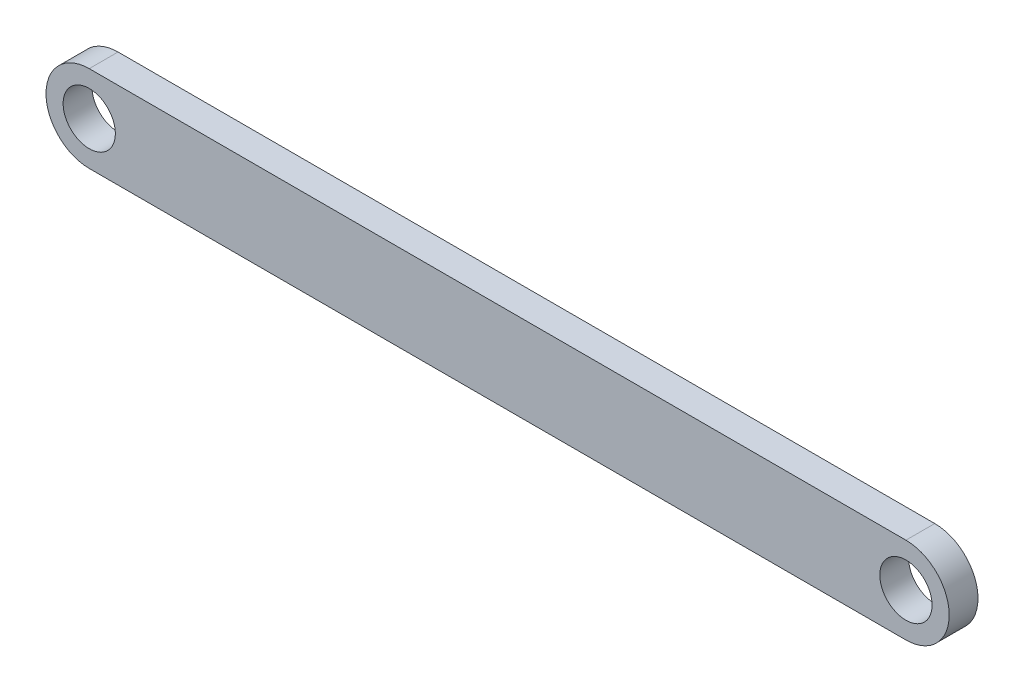
ISO-10303-21;
HEADER;
FILE_DESCRIPTION(('STEP AP214'),'2;1');
FILE_NAME('part.step','',(''),(''),'','','');
FILE_SCHEMA(('AUTOMOTIVE_DESIGN { 1 0 10303 214 1 1 1 1 }'));
ENDSEC;
DATA;
#1=APPLICATION_CONTEXT('core data for automotive mechanical design processes');
#2=APPLICATION_PROTOCOL_DEFINITION('international standard','automotive_design',2000,#1);
#3=PRODUCT_CONTEXT('',#1,'mechanical');
#4=PRODUCT('Part','Part','',(#3));
#5=PRODUCT_RELATED_PRODUCT_CATEGORY('part','',(#4));
#6=PRODUCT_DEFINITION_FORMATION('','',#4);
#7=PRODUCT_DEFINITION_CONTEXT('part definition',#1,'design');
#8=PRODUCT_DEFINITION('design','',#6,#7);
#9=PRODUCT_DEFINITION_SHAPE('','',#8);
#10=(LENGTH_UNIT() NAMED_UNIT(*) SI_UNIT(.MILLI.,.METRE.));
#11=(NAMED_UNIT(*) PLANE_ANGLE_UNIT() SI_UNIT($,.RADIAN.));
#12=(NAMED_UNIT(*) SI_UNIT($,.STERADIAN.) SOLID_ANGLE_UNIT());
#13=UNCERTAINTY_MEASURE_WITH_UNIT(LENGTH_MEASURE(1.E-05),#10,'distance_accuracy_value','');
#14=(GEOMETRIC_REPRESENTATION_CONTEXT(3) GLOBAL_UNCERTAINTY_ASSIGNED_CONTEXT((#13)) GLOBAL_UNIT_ASSIGNED_CONTEXT((#10,
#11,#12)) REPRESENTATION_CONTEXT('',''));
#15=CARTESIAN_POINT('',(0.,0.,0.));
#16=DIRECTION('',(0.,0.,1.));
#17=DIRECTION('',(1.,0.,0.));
#18=AXIS2_PLACEMENT_3D('',#15,#16,#17);
#19=CARTESIAN_POINT('',(0.,0.,5.08));
#20=DIRECTION('',(0.,0.,1.));
#21=DIRECTION('',(1.,0.,0.));
#22=AXIS2_PLACEMENT_3D('',#19,#20,#21);
#23=PLANE('',#22);
#24=CARTESIAN_POINT('',(0.,0.,5.08));
#25=DIRECTION('',(0.,0.,1.));
#26=DIRECTION('',(1.,0.,0.));
#27=AXIS2_PLACEMENT_3D('',#24,#25,#26);
#28=CIRCLE('',#27,4.60375);
#29=CARTESIAN_POINT('',(4.60375,0.,5.08));
#30=VERTEX_POINT('',#29);
#31=EDGE_CURVE('E106',#30,#30,#28,.T.);
#32=ORIENTED_EDGE('',*,*,#31,.F.);
#33=EDGE_LOOP('',(#32));
#34=FACE_BOUND('',#33,.T.);
#35=CARTESIAN_POINT('',(0.,0.,5.08));
#36=DIRECTION('',(0.,0.,1.));
#37=DIRECTION('',(1.,0.,0.));
#38=AXIS2_PLACEMENT_3D('',#35,#36,#37);
#39=CIRCLE('',#38,7.62);
#40=CARTESIAN_POINT('',(0.,7.62,5.08));
#41=VERTEX_POINT('',#40);
#42=CARTESIAN_POINT('',(0.,-7.62,5.08));
#43=VERTEX_POINT('',#42);
#44=EDGE_CURVE('E91',#41,#43,#39,.T.);
#45=ORIENTED_EDGE('',*,*,#44,.T.);
#46=DIRECTION('',(1.,0.,0.));
#47=VECTOR('',#46,1.);
#48=CARTESIAN_POINT('',(0.,-7.62,5.08));
#49=LINE('',#48,#47);
#50=CARTESIAN_POINT('',(143.933333333333,-7.62,5.08));
#51=VERTEX_POINT('',#50);
#52=EDGE_CURVE('E86',#43,#51,#49,.T.);
#53=ORIENTED_EDGE('',*,*,#52,.T.);
#54=CARTESIAN_POINT('',(143.933333333333,0.,5.08));
#55=DIRECTION('',(0.,0.,1.));
#56=DIRECTION('',(1.,0.,0.));
#57=AXIS2_PLACEMENT_3D('',#54,#55,#56);
#58=CIRCLE('',#57,7.62);
#59=CARTESIAN_POINT('',(143.933333333333,7.62,5.08));
#60=VERTEX_POINT('',#59);
#61=EDGE_CURVE('E89',#51,#60,#58,.T.);
#62=ORIENTED_EDGE('',*,*,#61,.T.);
#63=DIRECTION('',(-1.,0.,0.));
#64=VECTOR('',#63,1.);
#65=CARTESIAN_POINT('',(0.,7.62,5.08));
#66=LINE('',#65,#64);
#67=EDGE_CURVE('E56',#60,#41,#66,.T.);
#68=ORIENTED_EDGE('',*,*,#67,.T.);
#69=EDGE_LOOP('',(#45,#53,#62,#68));
#70=FACE_BOUND('',#69,.T.);
#71=CARTESIAN_POINT('',(143.933333333333,0.,5.08));
#72=DIRECTION('',(0.,0.,1.));
#73=DIRECTION('',(1.,0.,0.));
#74=AXIS2_PLACEMENT_3D('',#71,#72,#73);
#75=CIRCLE('',#74,4.60374999999998);
#76=CARTESIAN_POINT('',(148.537083333333,0.,5.08));
#77=VERTEX_POINT('',#76);
#78=EDGE_CURVE('E121',#77,#77,#75,.T.);
#79=ORIENTED_EDGE('',*,*,#78,.F.);
#80=EDGE_LOOP('',(#79));
#81=FACE_BOUND('',#80,.T.);
#82=ADVANCED_FACE('F39',(#34,#70,#81),#23,.T.);
#83=CARTESIAN_POINT('',(0.,0.,0.));
#84=DIRECTION('',(0.,0.,1.));
#85=DIRECTION('',(1.,0.,0.));
#86=AXIS2_PLACEMENT_3D('',#83,#84,#85);
#87=PLANE('',#86);
#88=CARTESIAN_POINT('',(0.,0.,0.));
#89=DIRECTION('',(0.,0.,1.));
#90=DIRECTION('',(1.,0.,0.));
#91=AXIS2_PLACEMENT_3D('',#88,#89,#90);
#92=CIRCLE('',#91,7.62);
#93=CARTESIAN_POINT('',(0.,7.62,0.));
#94=VERTEX_POINT('',#93);
#95=CARTESIAN_POINT('',(0.,-7.62,0.));
#96=VERTEX_POINT('',#95);
#97=EDGE_CURVE('E103',#94,#96,#92,.T.);
#98=ORIENTED_EDGE('',*,*,#97,.F.);
#99=DIRECTION('',(-1.,0.,0.));
#100=VECTOR('',#99,1.);
#101=CARTESIAN_POINT('',(0.,7.62,0.));
#102=LINE('',#101,#100);
#103=CARTESIAN_POINT('',(143.933333333333,7.62,0.));
#104=VERTEX_POINT('',#103);
#105=EDGE_CURVE('E79',#104,#94,#102,.T.);
#106=ORIENTED_EDGE('',*,*,#105,.F.);
#107=CARTESIAN_POINT('',(143.933333333333,0.,0.));
#108=DIRECTION('',(0.,0.,1.));
#109=DIRECTION('',(1.,0.,0.));
#110=AXIS2_PLACEMENT_3D('',#107,#108,#109);
#111=CIRCLE('',#110,7.62);
#112=CARTESIAN_POINT('',(143.933333333333,-7.62,0.));
#113=VERTEX_POINT('',#112);
#114=EDGE_CURVE('E73',#113,#104,#111,.T.);
#115=ORIENTED_EDGE('',*,*,#114,.F.);
#116=DIRECTION('',(1.,0.,0.));
#117=VECTOR('',#116,1.);
#118=CARTESIAN_POINT('',(0.,-7.62,0.));
#119=LINE('',#118,#117);
#120=EDGE_CURVE('E95',#96,#113,#119,.T.);
#121=ORIENTED_EDGE('',*,*,#120,.F.);
#122=EDGE_LOOP('',(#98,#106,#115,#121));
#123=FACE_BOUND('',#122,.T.);
#124=CARTESIAN_POINT('',(0.,0.,0.));
#125=DIRECTION('',(0.,0.,1.));
#126=DIRECTION('',(1.,0.,0.));
#127=AXIS2_PLACEMENT_3D('',#124,#125,#126);
#128=CIRCLE('',#127,4.60375);
#129=CARTESIAN_POINT('',(4.60375,0.,0.));
#130=VERTEX_POINT('',#129);
#131=EDGE_CURVE('E118',#130,#130,#128,.T.);
#132=ORIENTED_EDGE('',*,*,#131,.T.);
#133=EDGE_LOOP('',(#132));
#134=FACE_BOUND('',#133,.T.);
#135=CARTESIAN_POINT('',(143.933333333333,0.,0.));
#136=DIRECTION('',(0.,0.,1.));
#137=DIRECTION('',(1.,0.,0.));
#138=AXIS2_PLACEMENT_3D('',#135,#136,#137);
#139=CIRCLE('',#138,4.60374999999998);
#140=CARTESIAN_POINT('',(148.537083333333,0.,0.));
#141=VERTEX_POINT('',#140);
#142=EDGE_CURVE('E124',#141,#141,#139,.T.);
#143=ORIENTED_EDGE('',*,*,#142,.T.);
#144=EDGE_LOOP('',(#143));
#145=FACE_BOUND('',#144,.T.);
#146=ADVANCED_FACE('F114',(#123,#134,#145),#87,.F.);
#147=CARTESIAN_POINT('',(0.,0.,5.08));
#148=DIRECTION('',(0.,0.,-1.));
#149=DIRECTION('',(-1.,0.,0.));
#150=AXIS2_PLACEMENT_3D('',#147,#148,#149);
#151=CYLINDRICAL_SURFACE('',#150,7.62);
#152=ORIENTED_EDGE('',*,*,#97,.T.);
#153=DIRECTION('',(0.,0.,-1.));
#154=VECTOR('',#153,1.);
#155=CARTESIAN_POINT('',(0.,-7.62,5.08));
#156=LINE('',#155,#154);
#157=EDGE_CURVE('E11',#43,#96,#156,.T.);
#158=ORIENTED_EDGE('',*,*,#157,.F.);
#159=ORIENTED_EDGE('',*,*,#44,.F.);
#160=DIRECTION('',(0.,0.,-1.));
#161=VECTOR('',#160,1.);
#162=CARTESIAN_POINT('',(0.,7.62,5.08));
#163=LINE('',#162,#161);
#164=EDGE_CURVE('E99',#41,#94,#163,.T.);
#165=ORIENTED_EDGE('',*,*,#164,.T.);
#166=EDGE_LOOP('',(#152,#158,#159,#165));
#167=FACE_BOUND('',#166,.T.);
#168=ADVANCED_FACE('F41',(#167),#151,.T.);
#169=CARTESIAN_POINT('',(0.,-7.62,5.08));
#170=DIRECTION('',(0.,1.,0.));
#171=DIRECTION('',(0.,0.,1.));
#172=AXIS2_PLACEMENT_3D('',#169,#170,#171);
#173=PLANE('',#172);
#174=ORIENTED_EDGE('',*,*,#120,.T.);
#175=DIRECTION('',(0.,0.,-1.));
#176=VECTOR('',#175,1.);
#177=CARTESIAN_POINT('',(143.933333333333,-7.62,5.08));
#178=LINE('',#177,#176);
#179=EDGE_CURVE('E48',#51,#113,#178,.T.);
#180=ORIENTED_EDGE('',*,*,#179,.F.);
#181=ORIENTED_EDGE('',*,*,#52,.F.);
#182=ORIENTED_EDGE('',*,*,#157,.T.);
#183=EDGE_LOOP('',(#174,#180,#181,#182));
#184=FACE_BOUND('',#183,.T.);
#185=ADVANCED_FACE('F94',(#184),#173,.F.);
#186=CARTESIAN_POINT('',(143.933333333333,0.,5.08));
#187=DIRECTION('',(0.,0.,-1.));
#188=DIRECTION('',(-1.,0.,0.));
#189=AXIS2_PLACEMENT_3D('',#186,#187,#188);
#190=CYLINDRICAL_SURFACE('',#189,7.62);
#191=ORIENTED_EDGE('',*,*,#114,.T.);
#192=DIRECTION('',(0.,0.,-1.));
#193=VECTOR('',#192,1.);
#194=CARTESIAN_POINT('',(143.933333333333,7.62,5.08));
#195=LINE('',#194,#193);
#196=EDGE_CURVE('E96',#60,#104,#195,.T.);
#197=ORIENTED_EDGE('',*,*,#196,.F.);
#198=ORIENTED_EDGE('',*,*,#61,.F.);
#199=ORIENTED_EDGE('',*,*,#179,.T.);
#200=EDGE_LOOP('',(#191,#197,#198,#199));
#201=FACE_BOUND('',#200,.T.);
#202=ADVANCED_FACE('F97',(#201),#190,.T.);
#203=CARTESIAN_POINT('',(0.,7.62,5.08));
#204=DIRECTION('',(0.,-1.,0.));
#205=DIRECTION('',(0.,0.,-1.));
#206=AXIS2_PLACEMENT_3D('',#203,#204,#205);
#207=PLANE('',#206);
#208=ORIENTED_EDGE('',*,*,#105,.T.);
#209=ORIENTED_EDGE('',*,*,#164,.F.);
#210=ORIENTED_EDGE('',*,*,#67,.F.);
#211=ORIENTED_EDGE('',*,*,#196,.T.);
#212=EDGE_LOOP('',(#208,#209,#210,#211));
#213=FACE_BOUND('',#212,.T.);
#214=ADVANCED_FACE('F111',(#213),#207,.F.);
#215=CARTESIAN_POINT('',(0.,0.,5.08));
#216=DIRECTION('',(0.,0.,-1.));
#217=DIRECTION('',(-1.,0.,0.));
#218=AXIS2_PLACEMENT_3D('',#215,#216,#217);
#219=CYLINDRICAL_SURFACE('',#218,4.60375);
#220=ORIENTED_EDGE('',*,*,#31,.T.);
#221=EDGE_LOOP('',(#220));
#222=FACE_BOUND('',#221,.T.);
#223=ORIENTED_EDGE('',*,*,#131,.F.);
#224=EDGE_LOOP('',(#223));
#225=FACE_BOUND('',#224,.T.);
#226=ADVANCED_FACE('F141',(#222,#225),#219,.F.);
#227=CARTESIAN_POINT('',(143.933333333333,0.,5.08));
#228=DIRECTION('',(0.,0.,-1.));
#229=DIRECTION('',(-1.,0.,0.));
#230=AXIS2_PLACEMENT_3D('',#227,#228,#229);
#231=CYLINDRICAL_SURFACE('',#230,4.60374999999998);
#232=ORIENTED_EDGE('',*,*,#78,.T.);
#233=EDGE_LOOP('',(#232));
#234=FACE_BOUND('',#233,.T.);
#235=ORIENTED_EDGE('',*,*,#142,.F.);
#236=EDGE_LOOP('',(#235));
#237=FACE_BOUND('',#236,.T.);
#238=ADVANCED_FACE('F130',(#234,#237),#231,.F.);
#239=CLOSED_SHELL('',(#82,#146,#168,#185,#202,#214,#226,#238));
#240=MANIFOLD_SOLID_BREP('B2',#239);
#241=ADVANCED_BREP_SHAPE_REPRESENTATION('',(#18,#240),#14);
#242=SHAPE_DEFINITION_REPRESENTATION(#9,#241);
ENDSEC;
END-ISO-10303-21;
